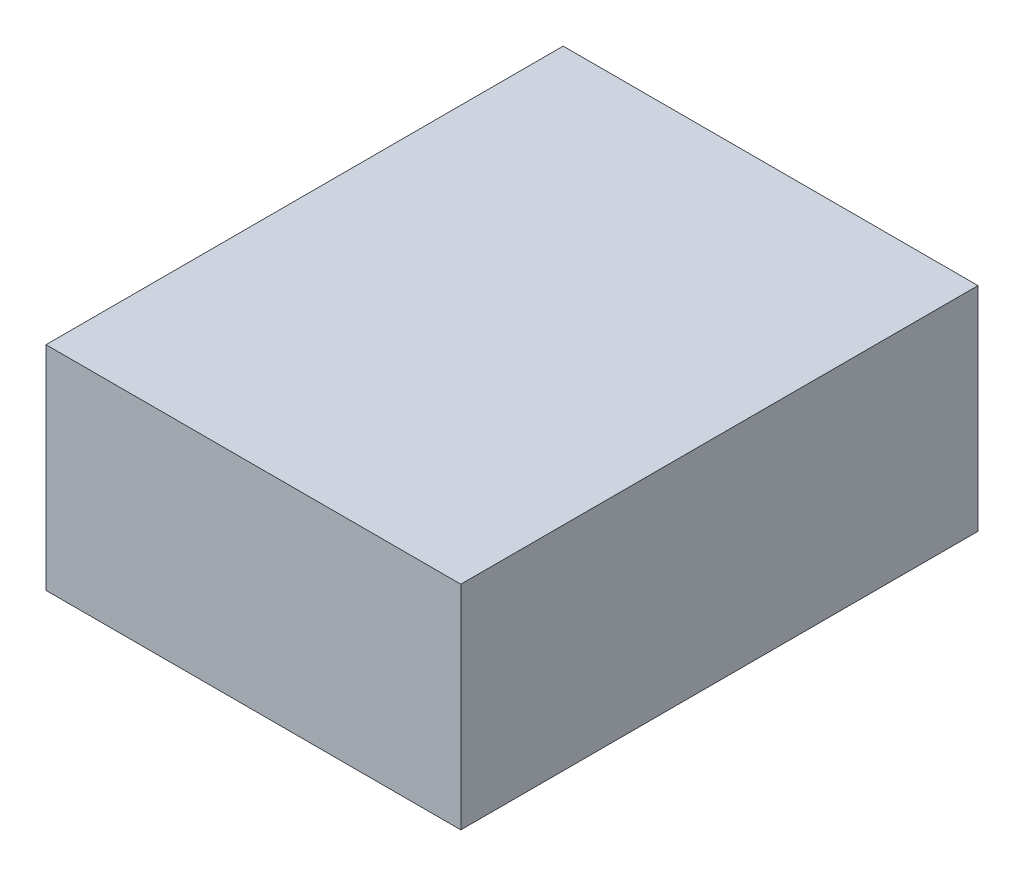
ISO-10303-21;
HEADER;
FILE_DESCRIPTION(('STEP AP214'),'2;1');
FILE_NAME('part.step','',(''),(''),'','','');
FILE_SCHEMA(('AUTOMOTIVE_DESIGN { 1 0 10303 214 1 1 1 1 }'));
ENDSEC;
DATA;
#1=APPLICATION_CONTEXT('core data for automotive mechanical design processes');
#2=APPLICATION_PROTOCOL_DEFINITION('international standard','automotive_design',2000,#1);
#3=PRODUCT_CONTEXT('',#1,'mechanical');
#4=PRODUCT('Part','Part','',(#3));
#5=PRODUCT_RELATED_PRODUCT_CATEGORY('part','',(#4));
#6=PRODUCT_DEFINITION_FORMATION('','',#4);
#7=PRODUCT_DEFINITION_CONTEXT('part definition',#1,'design');
#8=PRODUCT_DEFINITION('design','',#6,#7);
#9=PRODUCT_DEFINITION_SHAPE('','',#8);
#10=(LENGTH_UNIT() NAMED_UNIT(*) SI_UNIT(.MILLI.,.METRE.));
#11=(NAMED_UNIT(*) PLANE_ANGLE_UNIT() SI_UNIT($,.RADIAN.));
#12=(NAMED_UNIT(*) SI_UNIT($,.STERADIAN.) SOLID_ANGLE_UNIT());
#13=UNCERTAINTY_MEASURE_WITH_UNIT(LENGTH_MEASURE(1.E-05),#10,'distance_accuracy_value','');
#14=(GEOMETRIC_REPRESENTATION_CONTEXT(3) GLOBAL_UNCERTAINTY_ASSIGNED_CONTEXT((#13)) GLOBAL_UNIT_ASSIGNED_CONTEXT((#10,
#11,#12)) REPRESENTATION_CONTEXT('',''));
#15=CARTESIAN_POINT('',(0.,0.,0.));
#16=DIRECTION('',(0.,0.,1.));
#17=DIRECTION('',(1.,0.,0.));
#18=AXIS2_PLACEMENT_3D('',#15,#16,#17);
#19=CARTESIAN_POINT('',(0.,0.,9.6));
#20=DIRECTION('',(1.,0.,0.));
#21=DIRECTION('',(0.,0.,-1.));
#22=AXIS2_PLACEMENT_3D('',#19,#20,#21);
#23=PLANE('',#22);
#24=DIRECTION('',(0.,-1.,0.));
#25=VECTOR('',#24,1.);
#26=CARTESIAN_POINT('',(0.,0.,0.));
#27=LINE('',#26,#25);
#28=CARTESIAN_POINT('',(0.,3.95,0.));
#29=VERTEX_POINT('',#28);
#30=CARTESIAN_POINT('',(0.,0.,0.));
#31=VERTEX_POINT('',#30);
#32=EDGE_CURVE('E96',#29,#31,#27,.T.);
#33=ORIENTED_EDGE('',*,*,#32,.T.);
#34=DIRECTION('',(0.,0.,-1.));
#35=VECTOR('',#34,1.);
#36=CARTESIAN_POINT('',(0.,0.,9.6));
#37=LINE('',#36,#35);
#38=CARTESIAN_POINT('',(0.,0.,9.6));
#39=VERTEX_POINT('',#38);
#40=EDGE_CURVE('E11',#39,#31,#37,.T.);
#41=ORIENTED_EDGE('',*,*,#40,.F.);
#42=DIRECTION('',(0.,-1.,0.));
#43=VECTOR('',#42,1.);
#44=CARTESIAN_POINT('',(0.,0.,9.6));
#45=LINE('',#44,#43);
#46=CARTESIAN_POINT('',(0.,3.95,9.6));
#47=VERTEX_POINT('',#46);
#48=EDGE_CURVE('E84',#47,#39,#45,.T.);
#49=ORIENTED_EDGE('',*,*,#48,.F.);
#50=DIRECTION('',(0.,0.,-1.));
#51=VECTOR('',#50,1.);
#52=CARTESIAN_POINT('',(0.,3.95,9.6));
#53=LINE('',#52,#51);
#54=EDGE_CURVE('E92',#47,#29,#53,.T.);
#55=ORIENTED_EDGE('',*,*,#54,.T.);
#56=EDGE_LOOP('',(#33,#41,#49,#55));
#57=FACE_BOUND('',#56,.T.);
#58=ADVANCED_FACE('F33',(#57),#23,.F.);
#59=CARTESIAN_POINT('',(0.,0.,9.6));
#60=DIRECTION('',(0.,1.,0.));
#61=DIRECTION('',(0.,0.,1.));
#62=AXIS2_PLACEMENT_3D('',#59,#60,#61);
#63=PLANE('',#62);
#64=DIRECTION('',(1.,0.,0.));
#65=VECTOR('',#64,1.);
#66=CARTESIAN_POINT('',(0.,0.,0.));
#67=LINE('',#66,#65);
#68=CARTESIAN_POINT('',(7.7,0.,0.));
#69=VERTEX_POINT('',#68);
#70=EDGE_CURVE('E88',#31,#69,#67,.T.);
#71=ORIENTED_EDGE('',*,*,#70,.T.);
#72=DIRECTION('',(0.,0.,-1.));
#73=VECTOR('',#72,1.);
#74=CARTESIAN_POINT('',(7.7,0.,9.6));
#75=LINE('',#74,#73);
#76=CARTESIAN_POINT('',(7.7,0.,9.6));
#77=VERTEX_POINT('',#76);
#78=EDGE_CURVE('E41',#77,#69,#75,.T.);
#79=ORIENTED_EDGE('',*,*,#78,.F.);
#80=DIRECTION('',(1.,0.,0.));
#81=VECTOR('',#80,1.);
#82=CARTESIAN_POINT('',(0.,0.,9.6));
#83=LINE('',#82,#81);
#84=EDGE_CURVE('E79',#39,#77,#83,.T.);
#85=ORIENTED_EDGE('',*,*,#84,.F.);
#86=ORIENTED_EDGE('',*,*,#40,.T.);
#87=EDGE_LOOP('',(#71,#79,#85,#86));
#88=FACE_BOUND('',#87,.T.);
#89=ADVANCED_FACE('F87',(#88),#63,.F.);
#90=CARTESIAN_POINT('',(7.7,0.,9.6));
#91=DIRECTION('',(-1.,0.,0.));
#92=DIRECTION('',(0.,0.,1.));
#93=AXIS2_PLACEMENT_3D('',#90,#91,#92);
#94=PLANE('',#93);
#95=DIRECTION('',(0.,1.,0.));
#96=VECTOR('',#95,1.);
#97=CARTESIAN_POINT('',(7.7,0.,0.));
#98=LINE('',#97,#96);
#99=CARTESIAN_POINT('',(7.7,3.95,0.));
#100=VERTEX_POINT('',#99);
#101=EDGE_CURVE('E66',#69,#100,#98,.T.);
#102=ORIENTED_EDGE('',*,*,#101,.T.);
#103=DIRECTION('',(0.,0.,-1.));
#104=VECTOR('',#103,1.);
#105=CARTESIAN_POINT('',(7.7,3.95,9.6));
#106=LINE('',#105,#104);
#107=CARTESIAN_POINT('',(7.7,3.95,9.6));
#108=VERTEX_POINT('',#107);
#109=EDGE_CURVE('E89',#108,#100,#106,.T.);
#110=ORIENTED_EDGE('',*,*,#109,.F.);
#111=DIRECTION('',(0.,1.,0.));
#112=VECTOR('',#111,1.);
#113=CARTESIAN_POINT('',(7.7,0.,9.6));
#114=LINE('',#113,#112);
#115=EDGE_CURVE('E82',#77,#108,#114,.T.);
#116=ORIENTED_EDGE('',*,*,#115,.F.);
#117=ORIENTED_EDGE('',*,*,#78,.T.);
#118=EDGE_LOOP('',(#102,#110,#116,#117));
#119=FACE_BOUND('',#118,.T.);
#120=ADVANCED_FACE('F90',(#119),#94,.F.);
#121=CARTESIAN_POINT('',(0.,3.95,9.6));
#122=DIRECTION('',(0.,-1.,0.));
#123=DIRECTION('',(0.,0.,-1.));
#124=AXIS2_PLACEMENT_3D('',#121,#122,#123);
#125=PLANE('',#124);
#126=DIRECTION('',(-1.,0.,0.));
#127=VECTOR('',#126,1.);
#128=CARTESIAN_POINT('',(0.,3.95,0.));
#129=LINE('',#128,#127);
#130=EDGE_CURVE('E72',#100,#29,#129,.T.);
#131=ORIENTED_EDGE('',*,*,#130,.T.);
#132=ORIENTED_EDGE('',*,*,#54,.F.);
#133=DIRECTION('',(-1.,0.,0.));
#134=VECTOR('',#133,1.);
#135=CARTESIAN_POINT('',(0.,3.95,9.6));
#136=LINE('',#135,#134);
#137=EDGE_CURVE('E49',#108,#47,#136,.T.);
#138=ORIENTED_EDGE('',*,*,#137,.F.);
#139=ORIENTED_EDGE('',*,*,#109,.T.);
#140=EDGE_LOOP('',(#131,#132,#138,#139));
#141=FACE_BOUND('',#140,.T.);
#142=ADVANCED_FACE('F103',(#141),#125,.F.);
#143=CARTESIAN_POINT('',(0.,0.,9.6));
#144=DIRECTION('',(0.,0.,-1.));
#145=DIRECTION('',(-1.,0.,0.));
#146=AXIS2_PLACEMENT_3D('',#143,#144,#145);
#147=PLANE('',#146);
#148=ORIENTED_EDGE('',*,*,#48,.T.);
#149=ORIENTED_EDGE('',*,*,#84,.T.);
#150=ORIENTED_EDGE('',*,*,#115,.T.);
#151=ORIENTED_EDGE('',*,*,#137,.T.);
#152=EDGE_LOOP('',(#148,#149,#150,#151));
#153=FACE_BOUND('',#152,.T.);
#154=ADVANCED_FACE('F80',(#153),#147,.F.);
#155=CARTESIAN_POINT('',(0.,0.,0.));
#156=DIRECTION('',(0.,0.,-1.));
#157=DIRECTION('',(-1.,0.,0.));
#158=AXIS2_PLACEMENT_3D('',#155,#156,#157);
#159=PLANE('',#158);
#160=ORIENTED_EDGE('',*,*,#32,.F.);
#161=ORIENTED_EDGE('',*,*,#130,.F.);
#162=ORIENTED_EDGE('',*,*,#101,.F.);
#163=ORIENTED_EDGE('',*,*,#70,.F.);
#164=EDGE_LOOP('',(#160,#161,#162,#163));
#165=FACE_BOUND('',#164,.T.);
#166=ADVANCED_FACE('F106',(#165),#159,.T.);
#167=CLOSED_SHELL('',(#58,#89,#120,#142,#154,#166));
#168=MANIFOLD_SOLID_BREP('B2',#167);
#169=ADVANCED_BREP_SHAPE_REPRESENTATION('',(#18,#168),#14);
#170=SHAPE_DEFINITION_REPRESENTATION(#9,#169);
ENDSEC;
END-ISO-10303-21;
